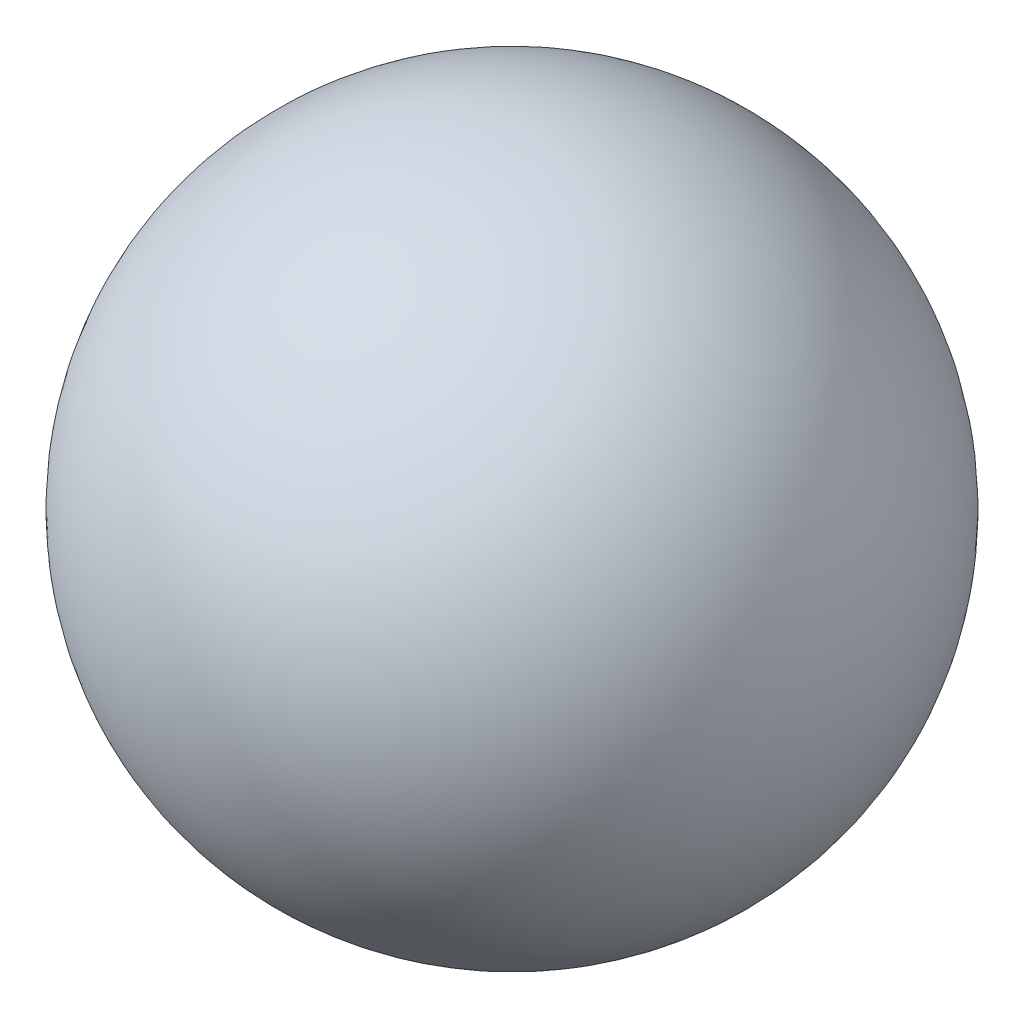
ISO-10303-21;
HEADER;
FILE_DESCRIPTION(('STEP AP214'),'2;1');
FILE_NAME('part.step','',(''),(''),'','','');
FILE_SCHEMA(('AUTOMOTIVE_DESIGN { 1 0 10303 214 1 1 1 1 }'));
ENDSEC;
DATA;
#1=APPLICATION_CONTEXT('core data for automotive mechanical design processes');
#2=APPLICATION_PROTOCOL_DEFINITION('international standard','automotive_design',2000,#1);
#3=PRODUCT_CONTEXT('',#1,'mechanical');
#4=PRODUCT('Part','Part','',(#3));
#5=PRODUCT_RELATED_PRODUCT_CATEGORY('part','',(#4));
#6=PRODUCT_DEFINITION_FORMATION('','',#4);
#7=PRODUCT_DEFINITION_CONTEXT('part definition',#1,'design');
#8=PRODUCT_DEFINITION('design','',#6,#7);
#9=PRODUCT_DEFINITION_SHAPE('','',#8);
#10=(LENGTH_UNIT() NAMED_UNIT(*) SI_UNIT(.MILLI.,.METRE.));
#11=(NAMED_UNIT(*) PLANE_ANGLE_UNIT() SI_UNIT($,.RADIAN.));
#12=(NAMED_UNIT(*) SI_UNIT($,.STERADIAN.) SOLID_ANGLE_UNIT());
#13=UNCERTAINTY_MEASURE_WITH_UNIT(LENGTH_MEASURE(1.E-05),#10,'distance_accuracy_value','');
#14=(GEOMETRIC_REPRESENTATION_CONTEXT(3) GLOBAL_UNCERTAINTY_ASSIGNED_CONTEXT((#13)) GLOBAL_UNIT_ASSIGNED_CONTEXT((#10,
#11,#12)) REPRESENTATION_CONTEXT('',''));
#15=CARTESIAN_POINT('',(0.,0.,0.));
#16=DIRECTION('',(0.,0.,1.));
#17=DIRECTION('',(1.,0.,0.));
#18=AXIS2_PLACEMENT_3D('',#15,#16,#17);
#19=CARTESIAN_POINT('',(0.,0.,0.));
#20=DIRECTION('',(0.,0.,-1.));
#21=DIRECTION('',(-0.999862365580315,0.0165906568928647,0.));
#22=AXIS2_PLACEMENT_3D('',#19,#20,#21);
#23=CIRCLE('',#22,50.);
#24=TRIMMED_CURVE('',#23,(PARAMETER_VALUE(-1.58738774487815)),
(PARAMETER_VALUE(1.58738774487815)),.T.,.PARAMETER.);
#25=CARTESIAN_POINT('',(0.829418672371554,-0.0137624948068488,0.));
#26=DIRECTION('',(0.0165906568928647,0.999862365580315,0.));
#27=AXIS1_PLACEMENT('',#25,#26);
#28=SURFACE_OF_REVOLUTION('',#24,#27);
#29=CARTESIAN_POINT('',(0.,-50.,0.));
#30=VERTEX_POINT('',#29);
#31=VERTEX_LOOP('',#30);
#32=FACE_BOUND('',#31,.T.);
#33=CARTESIAN_POINT('',(1.65883734474311,49.9724750103863,0.));
#34=VERTEX_POINT('',#33);
#35=VERTEX_LOOP('',#34);
#36=FACE_BOUND('',#35,.T.);
#37=ADVANCED_FACE('F37',(#32,#36),#28,.T.);
#38=CLOSED_SHELL('',(#37));
#39=MANIFOLD_SOLID_BREP('B2',#38);
#40=ADVANCED_BREP_SHAPE_REPRESENTATION('',(#18,#39),#14);
#41=SHAPE_DEFINITION_REPRESENTATION(#9,#40);
ENDSEC;
END-ISO-10303-21;
